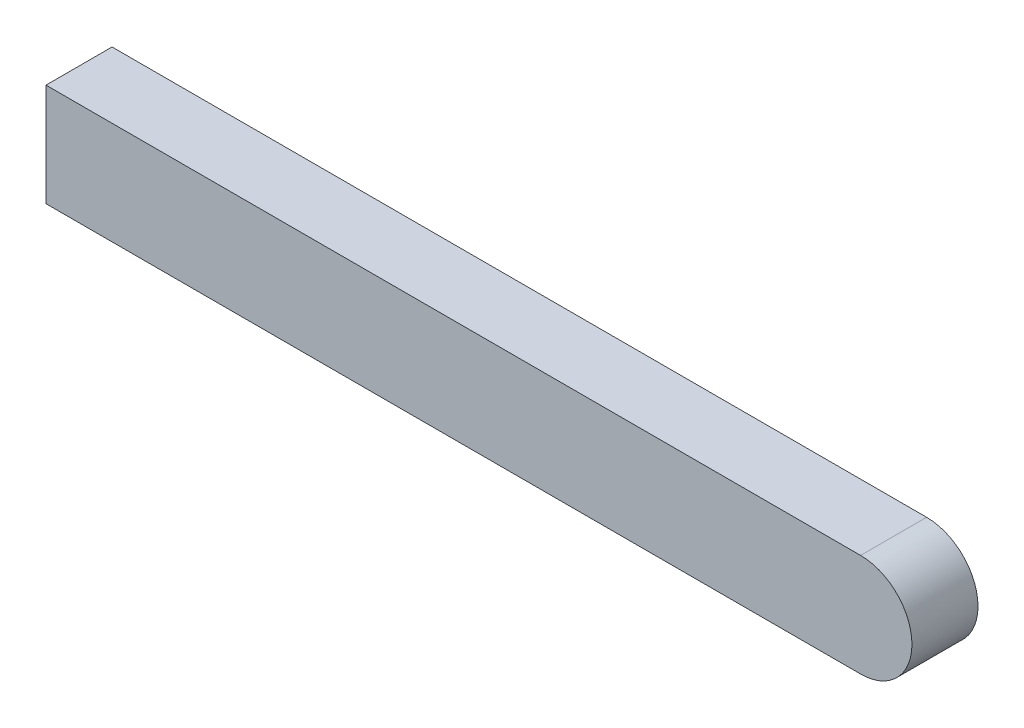
ISO-10303-21;
HEADER;
FILE_DESCRIPTION(('STEP AP214'),'2;1');
FILE_NAME('part.step','',(''),(''),'','','');
FILE_SCHEMA(('AUTOMOTIVE_DESIGN { 1 0 10303 214 1 1 1 1 }'));
ENDSEC;
DATA;
#1=APPLICATION_CONTEXT('core data for automotive mechanical design processes');
#2=APPLICATION_PROTOCOL_DEFINITION('international standard','automotive_design',2000,#1);
#3=PRODUCT_CONTEXT('',#1,'mechanical');
#4=PRODUCT('Part','Part','',(#3));
#5=PRODUCT_RELATED_PRODUCT_CATEGORY('part','',(#4));
#6=PRODUCT_DEFINITION_FORMATION('','',#4);
#7=PRODUCT_DEFINITION_CONTEXT('part definition',#1,'design');
#8=PRODUCT_DEFINITION('design','',#6,#7);
#9=PRODUCT_DEFINITION_SHAPE('','',#8);
#10=(LENGTH_UNIT() NAMED_UNIT(*) SI_UNIT(.MILLI.,.METRE.));
#11=(NAMED_UNIT(*) PLANE_ANGLE_UNIT() SI_UNIT($,.RADIAN.));
#12=(NAMED_UNIT(*) SI_UNIT($,.STERADIAN.) SOLID_ANGLE_UNIT());
#13=UNCERTAINTY_MEASURE_WITH_UNIT(LENGTH_MEASURE(1.E-05),#10,'distance_accuracy_value','');
#14=(GEOMETRIC_REPRESENTATION_CONTEXT(3) GLOBAL_UNCERTAINTY_ASSIGNED_CONTEXT((#13)) GLOBAL_UNIT_ASSIGNED_CONTEXT((#10,
#11,#12)) REPRESENTATION_CONTEXT('',''));
#15=CARTESIAN_POINT('',(0.,0.,0.));
#16=DIRECTION('',(0.,0.,1.));
#17=DIRECTION('',(1.,0.,0.));
#18=AXIS2_PLACEMENT_3D('',#15,#16,#17);
#19=CARTESIAN_POINT('',(-55.5000000000001,-7.00000000000003,8.99999999999982));
#20=DIRECTION('',(0.,1.,0.));
#21=DIRECTION('',(0.,0.,1.));
#22=AXIS2_PLACEMENT_3D('',#19,#20,#21);
#23=PLANE('',#22);
#24=DIRECTION('',(1.,0.,0.));
#25=VECTOR('',#24,1.);
#26=CARTESIAN_POINT('',(-55.5000000000001,-7.00000000000009,-1.89084858881472E-13));
#27=LINE('',#26,#25);
#28=CARTESIAN_POINT('',(-55.5000000000001,-7.00000000000009,-1.89084858881472E-13));
#29=VERTEX_POINT('',#28);
#30=CARTESIAN_POINT('',(55.4999999999999,-7.00000000000031,-1.14491749414469E-13));
#31=VERTEX_POINT('',#30);
#32=EDGE_CURVE('E84',#29,#31,#27,.T.);
#33=ORIENTED_EDGE('',*,*,#32,.T.);
#34=DIRECTION('',(0.,0.,-1.));
#35=VECTOR('',#34,1.);
#36=CARTESIAN_POINT('',(55.4999999999999,-7.00000000000014,8.99999999999992));
#37=LINE('',#36,#35);
#38=CARTESIAN_POINT('',(55.4999999999999,-7.00000000000014,8.99999999999992));
#39=VERTEX_POINT('',#38);
#40=EDGE_CURVE('E95',#39,#31,#37,.T.);
#41=ORIENTED_EDGE('',*,*,#40,.F.);
#42=DIRECTION('',(1.,0.,0.));
#43=VECTOR('',#42,1.);
#44=CARTESIAN_POINT('',(-55.5000000000001,-7.00000000000003,8.99999999999982));
#45=LINE('',#44,#43);
#46=CARTESIAN_POINT('',(-55.5000000000001,-7.00000000000003,8.99999999999982));
#47=VERTEX_POINT('',#46);
#48=EDGE_CURVE('E87',#47,#39,#45,.T.);
#49=ORIENTED_EDGE('',*,*,#48,.F.);
#50=DIRECTION('',(0.,0.,-1.));
#51=VECTOR('',#50,1.);
#52=CARTESIAN_POINT('',(-55.5000000000001,-7.00000000000003,8.99999999999982));
#53=LINE('',#52,#51);
#54=EDGE_CURVE('E42',#47,#29,#53,.T.);
#55=ORIENTED_EDGE('',*,*,#54,.T.);
#56=EDGE_LOOP('',(#33,#41,#49,#55));
#57=FACE_BOUND('',#56,.T.);
#58=ADVANCED_FACE('F34',(#57),#23,.F.);
#59=CARTESIAN_POINT('',(55.4999999999999,0.,9.00000000000003));
#60=DIRECTION('',(0.,0.,-1.));
#61=DIRECTION('',(-1.,0.,0.));
#62=AXIS2_PLACEMENT_3D('',#59,#60,#61);
#63=CYLINDRICAL_SURFACE('',#62,7.);
#64=CARTESIAN_POINT('',(55.5000000000001,-1.38777878078145E-13,0.));
#65=DIRECTION('',(0.,0.,1.));
#66=DIRECTION('',(1.,0.,0.));
#67=AXIS2_PLACEMENT_3D('',#64,#65,#66);
#68=CIRCLE('',#67,7.);
#69=CARTESIAN_POINT('',(55.5000000000001,7.00000000000009,0.));
#70=VERTEX_POINT('',#69);
#71=EDGE_CURVE('E88',#31,#70,#68,.T.);
#72=ORIENTED_EDGE('',*,*,#71,.T.);
#73=DIRECTION('',(0.,0.,-1.));
#74=VECTOR('',#73,1.);
#75=CARTESIAN_POINT('',(55.4999999999999,6.99999999999987,8.99999999999995));
#76=LINE('',#75,#74);
#77=CARTESIAN_POINT('',(55.4999999999999,6.99999999999987,8.99999999999995));
#78=VERTEX_POINT('',#77);
#79=EDGE_CURVE('E63',#78,#70,#76,.T.);
#80=ORIENTED_EDGE('',*,*,#79,.F.);
#81=CARTESIAN_POINT('',(55.4999999999999,0.,9.00000000000003));
#82=DIRECTION('',(0.,0.,1.));
#83=DIRECTION('',(1.,0.,0.));
#84=AXIS2_PLACEMENT_3D('',#81,#82,#83);
#85=CIRCLE('',#84,7.);
#86=EDGE_CURVE('E50',#39,#78,#85,.T.);
#87=ORIENTED_EDGE('',*,*,#86,.F.);
#88=ORIENTED_EDGE('',*,*,#40,.T.);
#89=EDGE_LOOP('',(#72,#80,#87,#88));
#90=FACE_BOUND('',#89,.T.);
#91=ADVANCED_FACE('F108',(#90),#63,.T.);
#92=CARTESIAN_POINT('',(-55.5000000000001,7.00000000000003,8.9999999999999));
#93=DIRECTION('',(0.,1.,0.));
#94=DIRECTION('',(0.,0.,1.));
#95=AXIS2_PLACEMENT_3D('',#92,#93,#94);
#96=PLANE('',#95);
#97=DIRECTION('',(1.,0.,0.));
#98=VECTOR('',#97,1.);
#99=CARTESIAN_POINT('',(-55.4999999999999,6.99999999999992,-1.89084858881472E-13));
#100=LINE('',#99,#98);
#101=CARTESIAN_POINT('',(-55.4999999999999,6.99999999999992,-1.89084858881472E-13));
#102=VERTEX_POINT('',#101);
#103=EDGE_CURVE('E83',#102,#70,#100,.T.);
#104=ORIENTED_EDGE('',*,*,#103,.F.);
#105=DIRECTION('',(0.,0.,-1.));
#106=VECTOR('',#105,1.);
#107=CARTESIAN_POINT('',(-55.5000000000001,7.00000000000003,8.9999999999999));
#108=LINE('',#107,#106);
#109=CARTESIAN_POINT('',(-55.5000000000001,7.00000000000003,8.9999999999999));
#110=VERTEX_POINT('',#109);
#111=EDGE_CURVE('E70',#110,#102,#108,.T.);
#112=ORIENTED_EDGE('',*,*,#111,.F.);
#113=DIRECTION('',(1.,0.,0.));
#114=VECTOR('',#113,1.);
#115=CARTESIAN_POINT('',(-55.5000000000001,7.00000000000003,8.9999999999999));
#116=LINE('',#115,#114);
#117=EDGE_CURVE('E77',#110,#78,#116,.T.);
#118=ORIENTED_EDGE('',*,*,#117,.T.);
#119=ORIENTED_EDGE('',*,*,#79,.T.);
#120=EDGE_LOOP('',(#104,#112,#118,#119));
#121=FACE_BOUND('',#120,.T.);
#122=ADVANCED_FACE('F86',(#121),#96,.T.);
#123=CARTESIAN_POINT('',(-55.5000000000001,0.,8.99999999999988));
#124=DIRECTION('',(0.,0.,1.));
#125=DIRECTION('',(1.,0.,0.));
#126=AXIS2_PLACEMENT_3D('',#123,#124,#125);
#127=PLANE('',#126);
#128=DIRECTION('',(0.,1.,0.));
#129=VECTOR('',#128,1.);
#130=CARTESIAN_POINT('',(-55.5000000000001,7.00000000000003,8.9999999999999));
#131=LINE('',#130,#129);
#132=EDGE_CURVE('E76',#47,#110,#131,.T.);
#133=ORIENTED_EDGE('',*,*,#132,.F.);
#134=ORIENTED_EDGE('',*,*,#48,.T.);
#135=ORIENTED_EDGE('',*,*,#86,.T.);
#136=ORIENTED_EDGE('',*,*,#117,.F.);
#137=EDGE_LOOP('',(#133,#134,#135,#136));
#138=FACE_BOUND('',#137,.T.);
#139=ADVANCED_FACE('F102',(#138),#127,.T.);
#140=CARTESIAN_POINT('',(-55.5000000000001,0.,-2.16840434497101E-13));
#141=DIRECTION('',(0.,0.,1.));
#142=DIRECTION('',(1.,0.,0.));
#143=AXIS2_PLACEMENT_3D('',#140,#141,#142);
#144=PLANE('',#143);
#145=ORIENTED_EDGE('',*,*,#32,.F.);
#146=DIRECTION('',(0.,1.,0.));
#147=VECTOR('',#146,1.);
#148=CARTESIAN_POINT('',(-55.5000000000001,0.,-2.16840434497101E-13));
#149=LINE('',#148,#147);
#150=EDGE_CURVE('E11',#29,#102,#149,.T.);
#151=ORIENTED_EDGE('',*,*,#150,.T.);
#152=ORIENTED_EDGE('',*,*,#103,.T.);
#153=ORIENTED_EDGE('',*,*,#71,.F.);
#154=EDGE_LOOP('',(#145,#151,#152,#153));
#155=FACE_BOUND('',#154,.T.);
#156=ADVANCED_FACE('F81',(#155),#144,.F.);
#157=CARTESIAN_POINT('',(-55.4999999999999,7.00000000000003,-1.00000000000008));
#158=DIRECTION('',(1.,0.,0.));
#159=DIRECTION('',(0.,1.,0.));
#160=AXIS2_PLACEMENT_3D('',#157,#158,#159);
#161=PLANE('',#160);
#162=ORIENTED_EDGE('',*,*,#132,.T.);
#163=ORIENTED_EDGE('',*,*,#111,.T.);
#164=ORIENTED_EDGE('',*,*,#150,.F.);
#165=ORIENTED_EDGE('',*,*,#54,.F.);
#166=EDGE_LOOP('',(#162,#163,#164,#165));
#167=FACE_BOUND('',#166,.T.);
#168=ADVANCED_FACE('F71',(#167),#161,.F.);
#169=CLOSED_SHELL('',(#58,#91,#122,#139,#156,#168));
#170=MANIFOLD_SOLID_BREP('B2',#169);
#171=ADVANCED_BREP_SHAPE_REPRESENTATION('',(#18,#170),#14);
#172=SHAPE_DEFINITION_REPRESENTATION(#9,#171);
ENDSEC;
END-ISO-10303-21;
